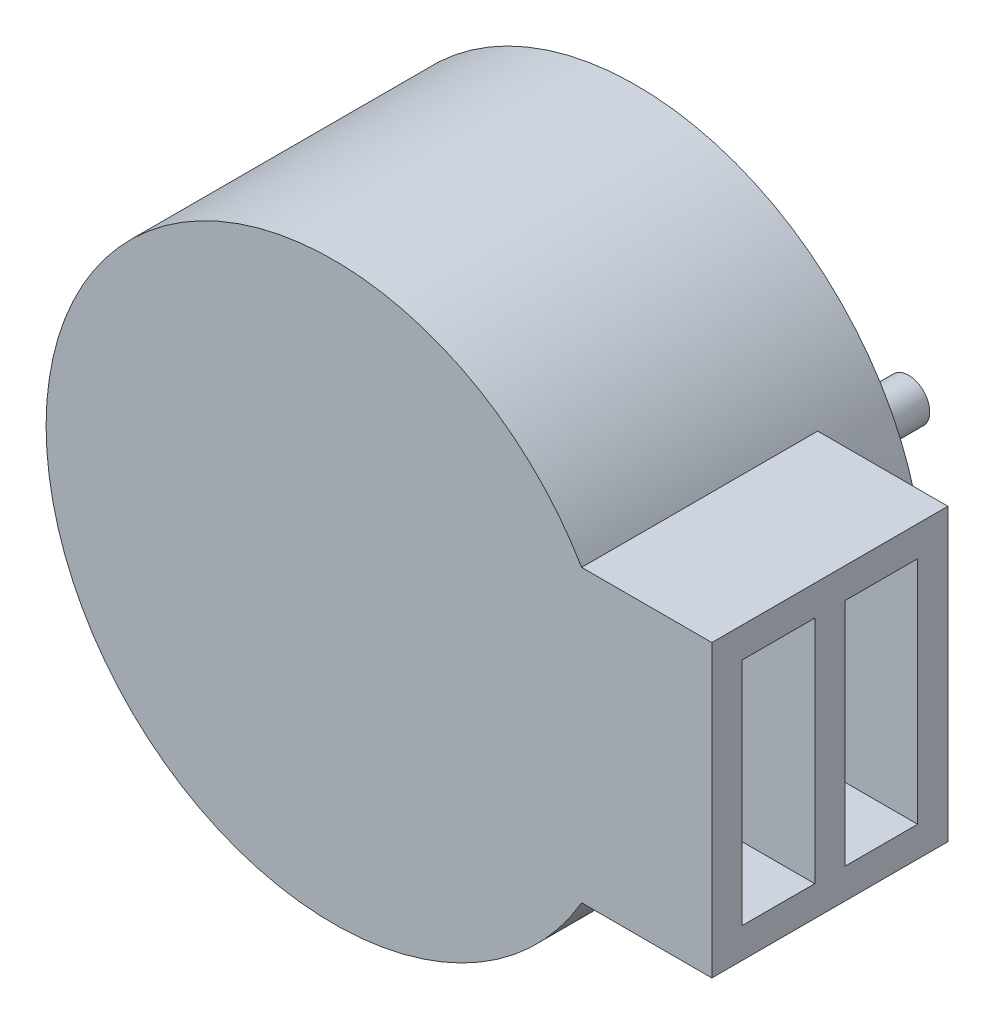
ISO-10303-21;
HEADER;
FILE_DESCRIPTION(('STEP AP214'),'2;1');
FILE_NAME('part.step','',(''),(''),'','','');
FILE_SCHEMA(('AUTOMOTIVE_DESIGN { 1 0 10303 214 1 1 1 1 }'));
ENDSEC;
DATA;
#1=APPLICATION_CONTEXT('core data for automotive mechanical design processes');
#2=APPLICATION_PROTOCOL_DEFINITION('international standard','automotive_design',2000,#1);
#3=PRODUCT_CONTEXT('',#1,'mechanical');
#4=PRODUCT('Part','Part','',(#3));
#5=PRODUCT_RELATED_PRODUCT_CATEGORY('part','',(#4));
#6=PRODUCT_DEFINITION_FORMATION('','',#4);
#7=PRODUCT_DEFINITION_CONTEXT('part definition',#1,'design');
#8=PRODUCT_DEFINITION('design','',#6,#7);
#9=PRODUCT_DEFINITION_SHAPE('','',#8);
#10=(LENGTH_UNIT() NAMED_UNIT(*) SI_UNIT(.MILLI.,.METRE.));
#11=(NAMED_UNIT(*) PLANE_ANGLE_UNIT() SI_UNIT($,.RADIAN.));
#12=(NAMED_UNIT(*) SI_UNIT($,.STERADIAN.) SOLID_ANGLE_UNIT());
#13=UNCERTAINTY_MEASURE_WITH_UNIT(LENGTH_MEASURE(1.E-05),#10,'distance_accuracy_value','');
#14=(GEOMETRIC_REPRESENTATION_CONTEXT(3) GLOBAL_UNCERTAINTY_ASSIGNED_CONTEXT((#13)) GLOBAL_UNIT_ASSIGNED_CONTEXT((#10,
#11,#12)) REPRESENTATION_CONTEXT('',''));
#15=CARTESIAN_POINT('',(0.,0.,0.));
#16=DIRECTION('',(0.,0.,1.));
#17=DIRECTION('',(1.,0.,0.));
#18=AXIS2_PLACEMENT_3D('',#15,#16,#17);
#19=CARTESIAN_POINT('',(6.25,-2.4,5.));
#20=DIRECTION('',(0.,1.,0.));
#21=DIRECTION('',(0.,0.,1.));
#22=AXIS2_PLACEMENT_3D('',#19,#20,#21);
#23=PLANE('',#22);
#24=DIRECTION('',(1.,0.,0.));
#25=VECTOR('',#24,1.);
#26=CARTESIAN_POINT('',(4.09908526381192,-2.4,1.1));
#27=LINE('',#26,#25);
#28=CARTESIAN_POINT('',(4.09908526381192,-2.4,1.1));
#29=VERTEX_POINT('',#28);
#30=CARTESIAN_POINT('',(6.25,-2.4,1.1));
#31=VERTEX_POINT('',#30);
#32=EDGE_CURVE('E201',#29,#31,#27,.T.);
#33=ORIENTED_EDGE('',*,*,#32,.T.);
#34=DIRECTION('',(0.,0.,-1.));
#35=VECTOR('',#34,1.);
#36=CARTESIAN_POINT('',(6.25,-2.4,5.));
#37=LINE('',#36,#35);
#38=CARTESIAN_POINT('',(6.25,-2.4,5.));
#39=VERTEX_POINT('',#38);
#40=EDGE_CURVE('E45',#39,#31,#37,.T.);
#41=ORIENTED_EDGE('',*,*,#40,.F.);
#42=DIRECTION('',(1.,0.,0.));
#43=VECTOR('',#42,1.);
#44=CARTESIAN_POINT('',(6.25,-2.4,5.));
#45=LINE('',#44,#43);
#46=CARTESIAN_POINT('',(4.09908526381192,-2.4,5.));
#47=VERTEX_POINT('',#46);
#48=EDGE_CURVE('E213',#47,#39,#45,.T.);
#49=ORIENTED_EDGE('',*,*,#48,.F.);
#50=DIRECTION('',(0.,0.,-1.));
#51=VECTOR('',#50,1.);
#52=CARTESIAN_POINT('',(4.09908526381192,-2.4,5.));
#53=LINE('',#52,#51);
#54=EDGE_CURVE('E12',#47,#29,#53,.T.);
#55=ORIENTED_EDGE('',*,*,#54,.T.);
#56=EDGE_LOOP('',(#33,#41,#49,#55));
#57=FACE_BOUND('',#56,.T.);
#58=ADVANCED_FACE('F37',(#57),#23,.F.);
#59=CARTESIAN_POINT('',(6.25,2.4,5.));
#60=DIRECTION('',(-1.,0.,0.));
#61=DIRECTION('',(0.,0.,1.));
#62=AXIS2_PLACEMENT_3D('',#59,#60,#61);
#63=PLANE('',#62);
#64=DIRECTION('',(0.,0.,-1.));
#65=VECTOR('',#64,1.);
#66=CARTESIAN_POINT('',(6.25,-1.9,4.5));
#67=LINE('',#66,#65);
#68=CARTESIAN_POINT('',(6.25,-1.9,4.5));
#69=VERTEX_POINT('',#68);
#70=CARTESIAN_POINT('',(6.25,-1.9,3.3));
#71=VERTEX_POINT('',#70);
#72=EDGE_CURVE('E158',#69,#71,#67,.T.);
#73=ORIENTED_EDGE('',*,*,#72,.F.);
#74=DIRECTION('',(0.,-1.,0.));
#75=VECTOR('',#74,1.);
#76=CARTESIAN_POINT('',(6.25,1.9,4.5));
#77=LINE('',#76,#75);
#78=CARTESIAN_POINT('',(6.25,1.9,4.5));
#79=VERTEX_POINT('',#78);
#80=EDGE_CURVE('E52',#79,#69,#77,.T.);
#81=ORIENTED_EDGE('',*,*,#80,.F.);
#82=DIRECTION('',(0.,0.,1.));
#83=VECTOR('',#82,1.);
#84=CARTESIAN_POINT('',(6.25,1.9,4.5));
#85=LINE('',#84,#83);
#86=CARTESIAN_POINT('',(6.25,1.9,3.3));
#87=VERTEX_POINT('',#86);
#88=EDGE_CURVE('E146',#87,#79,#85,.T.);
#89=ORIENTED_EDGE('',*,*,#88,.F.);
#90=DIRECTION('',(0.,1.,0.));
#91=VECTOR('',#90,1.);
#92=CARTESIAN_POINT('',(6.25,1.9,3.3));
#93=LINE('',#92,#91);
#94=EDGE_CURVE('E149',#71,#87,#93,.T.);
#95=ORIENTED_EDGE('',*,*,#94,.F.);
#96=EDGE_LOOP('',(#73,#81,#89,#95));
#97=FACE_BOUND('',#96,.T.);
#98=DIRECTION('',(0.,0.,-1.));
#99=VECTOR('',#98,1.);
#100=CARTESIAN_POINT('',(6.25,-1.9,2.8));
#101=LINE('',#100,#99);
#102=CARTESIAN_POINT('',(6.25,-1.9,2.8));
#103=VERTEX_POINT('',#102);
#104=CARTESIAN_POINT('',(6.25,-1.9,1.6));
#105=VERTEX_POINT('',#104);
#106=EDGE_CURVE('E184',#103,#105,#101,.T.);
#107=ORIENTED_EDGE('',*,*,#106,.F.);
#108=DIRECTION('',(0.,-1.,0.));
#109=VECTOR('',#108,1.);
#110=CARTESIAN_POINT('',(6.25,1.9,2.8));
#111=LINE('',#110,#109);
#112=CARTESIAN_POINT('',(6.25,1.9,2.8));
#113=VERTEX_POINT('',#112);
#114=EDGE_CURVE('E60',#113,#103,#111,.T.);
#115=ORIENTED_EDGE('',*,*,#114,.F.);
#116=DIRECTION('',(0.,0.,1.));
#117=VECTOR('',#116,1.);
#118=CARTESIAN_POINT('',(6.25,1.9,2.8));
#119=LINE('',#118,#117);
#120=CARTESIAN_POINT('',(6.25,1.9,1.6));
#121=VERTEX_POINT('',#120);
#122=EDGE_CURVE('E173',#121,#113,#119,.T.);
#123=ORIENTED_EDGE('',*,*,#122,.F.);
#124=DIRECTION('',(0.,1.,0.));
#125=VECTOR('',#124,1.);
#126=CARTESIAN_POINT('',(6.25,1.9,1.6));
#127=LINE('',#126,#125);
#128=EDGE_CURVE('E188',#105,#121,#127,.T.);
#129=ORIENTED_EDGE('',*,*,#128,.F.);
#130=EDGE_LOOP('',(#107,#115,#123,#129));
#131=FACE_BOUND('',#130,.T.);
#132=DIRECTION('',(0.,1.,0.));
#133=VECTOR('',#132,1.);
#134=CARTESIAN_POINT('',(6.25,-2.4,1.1));
#135=LINE('',#134,#133);
#136=CARTESIAN_POINT('',(6.25,2.4,1.1));
#137=VERTEX_POINT('',#136);
#138=EDGE_CURVE('E165',#31,#137,#135,.T.);
#139=ORIENTED_EDGE('',*,*,#138,.T.);
#140=DIRECTION('',(0.,0.,-1.));
#141=VECTOR('',#140,1.);
#142=CARTESIAN_POINT('',(6.25,2.4,5.));
#143=LINE('',#142,#141);
#144=CARTESIAN_POINT('',(6.25,2.4,5.));
#145=VERTEX_POINT('',#144);
#146=EDGE_CURVE('E224',#145,#137,#143,.T.);
#147=ORIENTED_EDGE('',*,*,#146,.F.);
#148=DIRECTION('',(0.,1.,0.));
#149=VECTOR('',#148,1.);
#150=CARTESIAN_POINT('',(6.25,2.4,5.));
#151=LINE('',#150,#149);
#152=EDGE_CURVE('E215',#39,#145,#151,.T.);
#153=ORIENTED_EDGE('',*,*,#152,.F.);
#154=ORIENTED_EDGE('',*,*,#40,.T.);
#155=EDGE_LOOP('',(#139,#147,#153,#154));
#156=FACE_BOUND('',#155,.T.);
#157=ADVANCED_FACE('F230',(#97,#131,#156),#63,.F.);
#158=CARTESIAN_POINT('',(4.09908526381192,2.4,5.));
#159=DIRECTION('',(0.,-1.,0.));
#160=DIRECTION('',(0.,0.,-1.));
#161=AXIS2_PLACEMENT_3D('',#158,#159,#160);
#162=PLANE('',#161);
#163=DIRECTION('',(-1.,0.,0.));
#164=VECTOR('',#163,1.);
#165=CARTESIAN_POINT('',(6.25,2.4,1.1));
#166=LINE('',#165,#164);
#167=CARTESIAN_POINT('',(4.09908526381192,2.4,1.1));
#168=VERTEX_POINT('',#167);
#169=EDGE_CURVE('E206',#137,#168,#166,.T.);
#170=ORIENTED_EDGE('',*,*,#169,.T.);
#171=DIRECTION('',(0.,0.,-1.));
#172=VECTOR('',#171,1.);
#173=CARTESIAN_POINT('',(4.09908526381192,2.4,5.));
#174=LINE('',#173,#172);
#175=CARTESIAN_POINT('',(4.09908526381192,2.4,5.));
#176=VERTEX_POINT('',#175);
#177=EDGE_CURVE('E219',#176,#168,#174,.T.);
#178=ORIENTED_EDGE('',*,*,#177,.F.);
#179=DIRECTION('',(-1.,0.,0.));
#180=VECTOR('',#179,1.);
#181=CARTESIAN_POINT('',(4.09908526381192,2.4,5.));
#182=LINE('',#181,#180);
#183=EDGE_CURVE('E217',#145,#176,#182,.T.);
#184=ORIENTED_EDGE('',*,*,#183,.F.);
#185=ORIENTED_EDGE('',*,*,#146,.T.);
#186=EDGE_LOOP('',(#170,#178,#184,#185));
#187=FACE_BOUND('',#186,.T.);
#188=ADVANCED_FACE('F239',(#187),#162,.F.);
#189=CARTESIAN_POINT('',(0.,0.,5.));
#190=DIRECTION('',(0.,0.,-1.));
#191=DIRECTION('',(-1.,0.,0.));
#192=AXIS2_PLACEMENT_3D('',#189,#190,#191);
#193=CYLINDRICAL_SURFACE('',#192,4.75);
#194=CARTESIAN_POINT('',(0.,0.,0.));
#195=DIRECTION('',(0.,0.,1.));
#196=DIRECTION('',(-1.,0.,0.));
#197=AXIS2_PLACEMENT_3D('',#194,#195,#196);
#198=CIRCLE('',#197,4.75);
#199=CARTESIAN_POINT('',(-4.75,0.,0.));
#200=VERTEX_POINT('',#199);
#201=EDGE_CURVE('E209',#200,#200,#198,.T.);
#202=ORIENTED_EDGE('',*,*,#201,.T.);
#203=EDGE_LOOP('',(#202));
#204=FACE_BOUND('',#203,.T.);
#205=CARTESIAN_POINT('',(0.,0.,1.1));
#206=DIRECTION('',(0.,0.,-1.));
#207=DIRECTION('',(-1.,0.,0.));
#208=AXIS2_PLACEMENT_3D('',#205,#206,#207);
#209=CIRCLE('',#208,4.75);
#210=EDGE_CURVE('E204',#168,#29,#209,.T.);
#211=ORIENTED_EDGE('',*,*,#210,.T.);
#212=ORIENTED_EDGE('',*,*,#54,.F.);
#213=CARTESIAN_POINT('',(0.,0.,5.));
#214=DIRECTION('',(0.,0.,1.));
#215=DIRECTION('',(-1.,0.,0.));
#216=AXIS2_PLACEMENT_3D('',#213,#214,#215);
#217=CIRCLE('',#216,4.75);
#218=EDGE_CURVE('E210',#176,#47,#217,.T.);
#219=ORIENTED_EDGE('',*,*,#218,.F.);
#220=ORIENTED_EDGE('',*,*,#177,.T.);
#221=EDGE_LOOP('',(#211,#212,#219,#220));
#222=FACE_BOUND('',#221,.T.);
#223=ADVANCED_FACE('F39',(#204,#222),#193,.T.);
#224=CARTESIAN_POINT('',(0.,0.,5.));
#225=DIRECTION('',(0.,0.,-1.));
#226=DIRECTION('',(-1.,0.,0.));
#227=AXIS2_PLACEMENT_3D('',#224,#225,#226);
#228=PLANE('',#227);
#229=ORIENTED_EDGE('',*,*,#218,.T.);
#230=ORIENTED_EDGE('',*,*,#48,.T.);
#231=ORIENTED_EDGE('',*,*,#152,.T.);
#232=ORIENTED_EDGE('',*,*,#183,.T.);
#233=EDGE_LOOP('',(#229,#230,#231,#232));
#234=FACE_BOUND('',#233,.T.);
#235=ADVANCED_FACE('F244',(#234),#228,.F.);
#236=CARTESIAN_POINT('',(0.,0.,0.));
#237=DIRECTION('',(0.,0.,-1.));
#238=DIRECTION('',(-1.,0.,0.));
#239=AXIS2_PLACEMENT_3D('',#236,#237,#238);
#240=PLANE('',#239);
#241=CARTESIAN_POINT('',(-2.,0.,0.));
#242=DIRECTION('',(0.,0.,-1.));
#243=DIRECTION('',(1.,0.,0.));
#244=AXIS2_PLACEMENT_3D('',#241,#242,#243);
#245=CIRCLE('',#244,0.35);
#246=CARTESIAN_POINT('',(-1.65,0.,0.));
#247=VERTEX_POINT('',#246);
#248=EDGE_CURVE('E431',#247,#247,#245,.T.);
#249=ORIENTED_EDGE('',*,*,#248,.F.);
#250=EDGE_LOOP('',(#249));
#251=FACE_BOUND('',#250,.T.);
#252=CARTESIAN_POINT('',(2.,0.,0.));
#253=DIRECTION('',(0.,0.,-1.));
#254=DIRECTION('',(-1.,0.,0.));
#255=AXIS2_PLACEMENT_3D('',#252,#253,#254);
#256=CIRCLE('',#255,0.35);
#257=CARTESIAN_POINT('',(1.65,0.,0.));
#258=VERTEX_POINT('',#257);
#259=EDGE_CURVE('E152',#258,#258,#256,.T.);
#260=ORIENTED_EDGE('',*,*,#259,.F.);
#261=EDGE_LOOP('',(#260));
#262=FACE_BOUND('',#261,.T.);
#263=ORIENTED_EDGE('',*,*,#201,.F.);
#264=EDGE_LOOP('',(#263));
#265=FACE_BOUND('',#264,.T.);
#266=ADVANCED_FACE('F246',(#251,#262,#265),#240,.T.);
#267=CARTESIAN_POINT('',(0.,0.,1.1));
#268=DIRECTION('',(0.,0.,-1.));
#269=DIRECTION('',(-1.,0.,0.));
#270=AXIS2_PLACEMENT_3D('',#267,#268,#269);
#271=PLANE('',#270);
#272=ORIENTED_EDGE('',*,*,#210,.F.);
#273=ORIENTED_EDGE('',*,*,#169,.F.);
#274=ORIENTED_EDGE('',*,*,#138,.F.);
#275=ORIENTED_EDGE('',*,*,#32,.F.);
#276=EDGE_LOOP('',(#272,#273,#274,#275));
#277=FACE_BOUND('',#276,.T.);
#278=ADVANCED_FACE('F236',(#277),#271,.T.);
#279=CARTESIAN_POINT('',(2.25,1.9,2.8));
#280=DIRECTION('',(0.,0.,1.));
#281=DIRECTION('',(0.,-1.,0.));
#282=AXIS2_PLACEMENT_3D('',#279,#280,#281);
#283=PLANE('',#282);
#284=ORIENTED_EDGE('',*,*,#114,.T.);
#285=DIRECTION('',(1.,0.,0.));
#286=VECTOR('',#285,1.);
#287=CARTESIAN_POINT('',(2.25,-1.9,2.8));
#288=LINE('',#287,#286);
#289=CARTESIAN_POINT('',(2.25,-1.9,2.8));
#290=VERTEX_POINT('',#289);
#291=EDGE_CURVE('E182',#290,#103,#288,.T.);
#292=ORIENTED_EDGE('',*,*,#291,.F.);
#293=DIRECTION('',(0.,-1.,0.));
#294=VECTOR('',#293,1.);
#295=CARTESIAN_POINT('',(2.25,1.9,2.8));
#296=LINE('',#295,#294);
#297=CARTESIAN_POINT('',(2.25,1.9,2.8));
#298=VERTEX_POINT('',#297);
#299=EDGE_CURVE('E169',#298,#290,#296,.T.);
#300=ORIENTED_EDGE('',*,*,#299,.F.);
#301=DIRECTION('',(1.,0.,0.));
#302=VECTOR('',#301,1.);
#303=CARTESIAN_POINT('',(2.25,1.9,2.8));
#304=LINE('',#303,#302);
#305=EDGE_CURVE('E159',#298,#113,#304,.T.);
#306=ORIENTED_EDGE('',*,*,#305,.T.);
#307=EDGE_LOOP('',(#284,#292,#300,#306));
#308=FACE_BOUND('',#307,.T.);
#309=ADVANCED_FACE('F283',(#308),#283,.F.);
#310=CARTESIAN_POINT('',(2.25,1.9,2.8));
#311=DIRECTION('',(0.,1.,0.));
#312=DIRECTION('',(0.,0.,1.));
#313=AXIS2_PLACEMENT_3D('',#310,#311,#312);
#314=PLANE('',#313);
#315=ORIENTED_EDGE('',*,*,#122,.T.);
#316=ORIENTED_EDGE('',*,*,#305,.F.);
#317=DIRECTION('',(0.,0.,1.));
#318=VECTOR('',#317,1.);
#319=CARTESIAN_POINT('',(2.25,1.9,2.8));
#320=LINE('',#319,#318);
#321=CARTESIAN_POINT('',(2.25,1.9,1.6));
#322=VERTEX_POINT('',#321);
#323=EDGE_CURVE('E179',#322,#298,#320,.T.);
#324=ORIENTED_EDGE('',*,*,#323,.F.);
#325=DIRECTION('',(1.,0.,0.));
#326=VECTOR('',#325,1.);
#327=CARTESIAN_POINT('',(2.25,1.9,1.6));
#328=LINE('',#327,#326);
#329=EDGE_CURVE('E194',#322,#121,#328,.T.);
#330=ORIENTED_EDGE('',*,*,#329,.T.);
#331=EDGE_LOOP('',(#315,#316,#324,#330));
#332=FACE_BOUND('',#331,.T.);
#333=ADVANCED_FACE('F296',(#332),#314,.F.);
#334=CARTESIAN_POINT('',(2.25,1.9,1.6));
#335=DIRECTION('',(0.,0.,-1.));
#336=DIRECTION('',(0.,1.,0.));
#337=AXIS2_PLACEMENT_3D('',#334,#335,#336);
#338=PLANE('',#337);
#339=ORIENTED_EDGE('',*,*,#128,.T.);
#340=ORIENTED_EDGE('',*,*,#329,.F.);
#341=DIRECTION('',(0.,1.,0.));
#342=VECTOR('',#341,1.);
#343=CARTESIAN_POINT('',(2.25,1.9,1.6));
#344=LINE('',#343,#342);
#345=CARTESIAN_POINT('',(2.25,-1.9,1.6));
#346=VERTEX_POINT('',#345);
#347=EDGE_CURVE('E176',#346,#322,#344,.T.);
#348=ORIENTED_EDGE('',*,*,#347,.F.);
#349=DIRECTION('',(1.,0.,0.));
#350=VECTOR('',#349,1.);
#351=CARTESIAN_POINT('',(2.25,-1.9,1.6));
#352=LINE('',#351,#350);
#353=EDGE_CURVE('E196',#346,#105,#352,.T.);
#354=ORIENTED_EDGE('',*,*,#353,.T.);
#355=EDGE_LOOP('',(#339,#340,#348,#354));
#356=FACE_BOUND('',#355,.T.);
#357=ADVANCED_FACE('F305',(#356),#338,.F.);
#358=CARTESIAN_POINT('',(2.25,-1.9,2.8));
#359=DIRECTION('',(0.,-1.,0.));
#360=DIRECTION('',(0.,0.,-1.));
#361=AXIS2_PLACEMENT_3D('',#358,#359,#360);
#362=PLANE('',#361);
#363=ORIENTED_EDGE('',*,*,#106,.T.);
#364=ORIENTED_EDGE('',*,*,#353,.F.);
#365=DIRECTION('',(0.,0.,-1.));
#366=VECTOR('',#365,1.);
#367=CARTESIAN_POINT('',(2.25,-1.9,2.8));
#368=LINE('',#367,#366);
#369=EDGE_CURVE('E172',#290,#346,#368,.T.);
#370=ORIENTED_EDGE('',*,*,#369,.F.);
#371=ORIENTED_EDGE('',*,*,#291,.T.);
#372=EDGE_LOOP('',(#363,#364,#370,#371));
#373=FACE_BOUND('',#372,.T.);
#374=ADVANCED_FACE('F315',(#373),#362,.F.);
#375=CARTESIAN_POINT('',(2.25,0.,0.));
#376=DIRECTION('',(1.,0.,0.));
#377=DIRECTION('',(0.,0.,-1.));
#378=AXIS2_PLACEMENT_3D('',#375,#376,#377);
#379=PLANE('',#378);
#380=ORIENTED_EDGE('',*,*,#299,.T.);
#381=ORIENTED_EDGE('',*,*,#369,.T.);
#382=ORIENTED_EDGE('',*,*,#347,.T.);
#383=ORIENTED_EDGE('',*,*,#323,.T.);
#384=EDGE_LOOP('',(#380,#381,#382,#383));
#385=FACE_BOUND('',#384,.T.);
#386=ADVANCED_FACE('F325',(#385),#379,.T.);
#387=CARTESIAN_POINT('',(2.25,1.9,4.5));
#388=DIRECTION('',(0.,0.,1.));
#389=DIRECTION('',(0.,-1.,0.));
#390=AXIS2_PLACEMENT_3D('',#387,#388,#389);
#391=PLANE('',#390);
#392=ORIENTED_EDGE('',*,*,#80,.T.);
#393=DIRECTION('',(1.,0.,0.));
#394=VECTOR('',#393,1.);
#395=CARTESIAN_POINT('',(2.25,-1.9,4.5));
#396=LINE('',#395,#394);
#397=CARTESIAN_POINT('',(2.25,-1.9,4.5));
#398=VERTEX_POINT('',#397);
#399=EDGE_CURVE('E124',#398,#69,#396,.T.);
#400=ORIENTED_EDGE('',*,*,#399,.F.);
#401=DIRECTION('',(0.,-1.,0.));
#402=VECTOR('',#401,1.);
#403=CARTESIAN_POINT('',(2.25,1.9,4.5));
#404=LINE('',#403,#402);
#405=CARTESIAN_POINT('',(2.25,1.9,4.5));
#406=VERTEX_POINT('',#405);
#407=EDGE_CURVE('E128',#406,#398,#404,.T.);
#408=ORIENTED_EDGE('',*,*,#407,.F.);
#409=DIRECTION('',(1.,0.,0.));
#410=VECTOR('',#409,1.);
#411=CARTESIAN_POINT('',(2.25,1.9,4.5));
#412=LINE('',#411,#410);
#413=EDGE_CURVE('E163',#406,#79,#412,.T.);
#414=ORIENTED_EDGE('',*,*,#413,.T.);
#415=EDGE_LOOP('',(#392,#400,#408,#414));
#416=FACE_BOUND('',#415,.T.);
#417=ADVANCED_FACE('F126',(#416),#391,.F.);
#418=CARTESIAN_POINT('',(2.25,1.9,4.5));
#419=DIRECTION('',(0.,1.,0.));
#420=DIRECTION('',(0.,0.,1.));
#421=AXIS2_PLACEMENT_3D('',#418,#419,#420);
#422=PLANE('',#421);
#423=ORIENTED_EDGE('',*,*,#88,.T.);
#424=ORIENTED_EDGE('',*,*,#413,.F.);
#425=DIRECTION('',(0.,0.,1.));
#426=VECTOR('',#425,1.);
#427=CARTESIAN_POINT('',(2.25,1.9,4.5));
#428=LINE('',#427,#426);
#429=CARTESIAN_POINT('',(2.25,1.9,3.3));
#430=VERTEX_POINT('',#429);
#431=EDGE_CURVE('E134',#430,#406,#428,.T.);
#432=ORIENTED_EDGE('',*,*,#431,.F.);
#433=DIRECTION('',(1.,0.,0.));
#434=VECTOR('',#433,1.);
#435=CARTESIAN_POINT('',(2.25,1.9,3.3));
#436=LINE('',#435,#434);
#437=EDGE_CURVE('E166',#430,#87,#436,.T.);
#438=ORIENTED_EDGE('',*,*,#437,.T.);
#439=EDGE_LOOP('',(#423,#424,#432,#438));
#440=FACE_BOUND('',#439,.T.);
#441=ADVANCED_FACE('F344',(#440),#422,.F.);
#442=CARTESIAN_POINT('',(2.25,1.9,3.3));
#443=DIRECTION('',(0.,0.,-1.));
#444=DIRECTION('',(0.,1.,0.));
#445=AXIS2_PLACEMENT_3D('',#442,#443,#444);
#446=PLANE('',#445);
#447=ORIENTED_EDGE('',*,*,#94,.T.);
#448=ORIENTED_EDGE('',*,*,#437,.F.);
#449=DIRECTION('',(0.,1.,0.));
#450=VECTOR('',#449,1.);
#451=CARTESIAN_POINT('',(2.25,1.9,3.3));
#452=LINE('',#451,#450);
#453=CARTESIAN_POINT('',(2.25,-1.9,3.3));
#454=VERTEX_POINT('',#453);
#455=EDGE_CURVE('E142',#454,#430,#452,.T.);
#456=ORIENTED_EDGE('',*,*,#455,.F.);
#457=DIRECTION('',(1.,0.,0.));
#458=VECTOR('',#457,1.);
#459=CARTESIAN_POINT('',(2.25,-1.9,3.3));
#460=LINE('',#459,#458);
#461=EDGE_CURVE('E133',#454,#71,#460,.T.);
#462=ORIENTED_EDGE('',*,*,#461,.T.);
#463=EDGE_LOOP('',(#447,#448,#456,#462));
#464=FACE_BOUND('',#463,.T.);
#465=ADVANCED_FACE('F353',(#464),#446,.F.);
#466=CARTESIAN_POINT('',(2.25,-1.9,4.5));
#467=DIRECTION('',(0.,-1.,0.));
#468=DIRECTION('',(0.,0.,-1.));
#469=AXIS2_PLACEMENT_3D('',#466,#467,#468);
#470=PLANE('',#469);
#471=ORIENTED_EDGE('',*,*,#72,.T.);
#472=ORIENTED_EDGE('',*,*,#461,.F.);
#473=DIRECTION('',(0.,0.,-1.));
#474=VECTOR('',#473,1.);
#475=CARTESIAN_POINT('',(2.25,-1.9,4.5));
#476=LINE('',#475,#474);
#477=EDGE_CURVE('E137',#398,#454,#476,.T.);
#478=ORIENTED_EDGE('',*,*,#477,.F.);
#479=ORIENTED_EDGE('',*,*,#399,.T.);
#480=EDGE_LOOP('',(#471,#472,#478,#479));
#481=FACE_BOUND('',#480,.T.);
#482=ADVANCED_FACE('F138',(#481),#470,.F.);
#483=CARTESIAN_POINT('',(2.25,0.,0.));
#484=DIRECTION('',(1.,0.,0.));
#485=DIRECTION('',(0.,0.,-1.));
#486=AXIS2_PLACEMENT_3D('',#483,#484,#485);
#487=PLANE('',#486);
#488=ORIENTED_EDGE('',*,*,#407,.T.);
#489=ORIENTED_EDGE('',*,*,#477,.T.);
#490=ORIENTED_EDGE('',*,*,#455,.T.);
#491=ORIENTED_EDGE('',*,*,#431,.T.);
#492=EDGE_LOOP('',(#488,#489,#490,#491));
#493=FACE_BOUND('',#492,.T.);
#494=ADVANCED_FACE('F144',(#493),#487,.T.);
#495=CARTESIAN_POINT('',(2.,0.,-2.5));
#496=DIRECTION('',(0.,0.,1.));
#497=DIRECTION('',(1.,0.,0.));
#498=AXIS2_PLACEMENT_3D('',#495,#496,#497);
#499=CYLINDRICAL_SURFACE('',#498,0.35);
#500=CARTESIAN_POINT('',(2.,0.,-2.5));
#501=DIRECTION('',(0.,0.,-1.));
#502=DIRECTION('',(-1.,0.,0.));
#503=AXIS2_PLACEMENT_3D('',#500,#501,#502);
#504=CIRCLE('',#503,0.35);
#505=CARTESIAN_POINT('',(1.65,0.,-2.5));
#506=VERTEX_POINT('',#505);
#507=EDGE_CURVE('E185',#506,#506,#504,.T.);
#508=ORIENTED_EDGE('',*,*,#507,.F.);
#509=EDGE_LOOP('',(#508));
#510=FACE_BOUND('',#509,.T.);
#511=ORIENTED_EDGE('',*,*,#259,.T.);
#512=EDGE_LOOP('',(#511));
#513=FACE_BOUND('',#512,.T.);
#514=ADVANCED_FACE('F380',(#510,#513),#499,.T.);
#515=CARTESIAN_POINT('',(2.,0.,-2.5));
#516=DIRECTION('',(0.,0.,-1.));
#517=DIRECTION('',(-1.,0.,0.));
#518=AXIS2_PLACEMENT_3D('',#515,#516,#517);
#519=PLANE('',#518);
#520=ORIENTED_EDGE('',*,*,#507,.T.);
#521=EDGE_LOOP('',(#520));
#522=FACE_BOUND('',#521,.T.);
#523=ADVANCED_FACE('F394',(#522),#519,.T.);
#524=CARTESIAN_POINT('',(-2.,0.,-2.5));
#525=DIRECTION('',(0.,0.,1.));
#526=DIRECTION('',(1.,0.,0.));
#527=AXIS2_PLACEMENT_3D('',#524,#525,#526);
#528=CYLINDRICAL_SURFACE('',#527,0.35);
#529=CARTESIAN_POINT('',(-2.,0.,-2.5));
#530=DIRECTION('',(0.,0.,-1.));
#531=DIRECTION('',(1.,0.,0.));
#532=AXIS2_PLACEMENT_3D('',#529,#530,#531);
#533=CIRCLE('',#532,0.35);
#534=CARTESIAN_POINT('',(-1.65,0.,-2.5));
#535=VERTEX_POINT('',#534);
#536=EDGE_CURVE('E430',#535,#535,#533,.T.);
#537=ORIENTED_EDGE('',*,*,#536,.F.);
#538=EDGE_LOOP('',(#537));
#539=FACE_BOUND('',#538,.T.);
#540=ORIENTED_EDGE('',*,*,#248,.T.);
#541=EDGE_LOOP('',(#540));
#542=FACE_BOUND('',#541,.T.);
#543=ADVANCED_FACE('F404',(#539,#542),#528,.T.);
#544=CARTESIAN_POINT('',(-2.,0.,-2.5));
#545=DIRECTION('',(0.,0.,1.));
#546=DIRECTION('',(1.,0.,0.));
#547=AXIS2_PLACEMENT_3D('',#544,#545,#546);
#548=PLANE('',#547);
#549=ORIENTED_EDGE('',*,*,#536,.T.);
#550=EDGE_LOOP('',(#549));
#551=FACE_BOUND('',#550,.T.);
#552=ADVANCED_FACE('F414',(#551),#548,.F.);
#553=CLOSED_SHELL('',(#58,#157,#188,#223,#235,#266,#278,#309,#333,#357,#374,#386,#417,#441,#465,
#482,#494,#514,#523,#543,#552));
#554=MANIFOLD_SOLID_BREP('B2',#553);
#555=ADVANCED_BREP_SHAPE_REPRESENTATION('',(#18,#554),#14);
#556=SHAPE_DEFINITION_REPRESENTATION(#9,#555);
ENDSEC;
END-ISO-10303-21;
